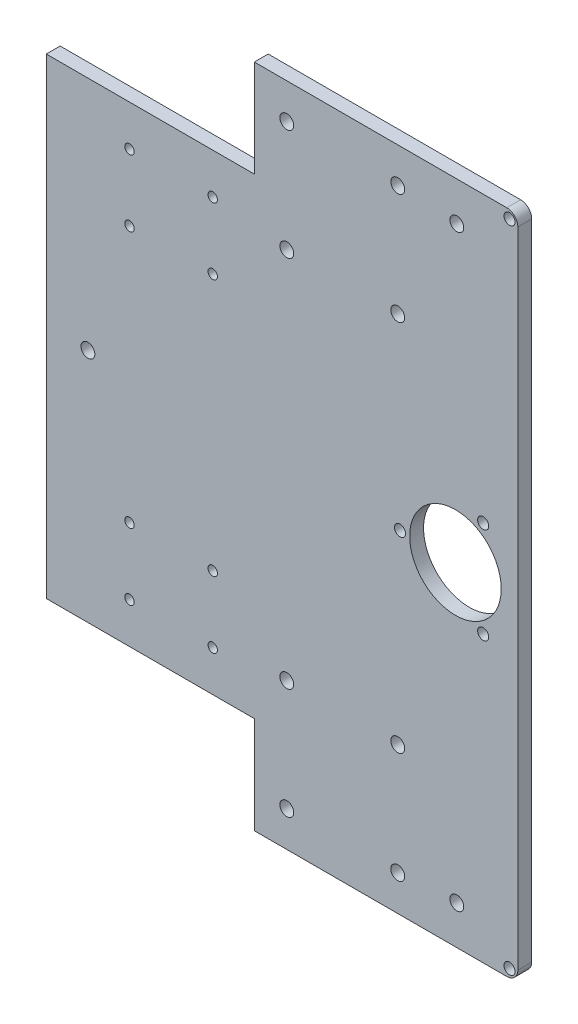
ISO-10303-21;
HEADER;
FILE_DESCRIPTION(('STEP AP214'),'2;1');
FILE_NAME('part.step','',(''),(''),'','','');
FILE_SCHEMA(('AUTOMOTIVE_DESIGN { 1 0 10303 214 1 1 1 1 }'));
ENDSEC;
DATA;
#1=APPLICATION_CONTEXT('core data for automotive mechanical design processes');
#2=APPLICATION_PROTOCOL_DEFINITION('international standard','automotive_design',2000,#1);
#3=PRODUCT_CONTEXT('',#1,'mechanical');
#4=PRODUCT('Part','Part','',(#3));
#5=PRODUCT_RELATED_PRODUCT_CATEGORY('part','',(#4));
#6=PRODUCT_DEFINITION_FORMATION('','',#4);
#7=PRODUCT_DEFINITION_CONTEXT('part definition',#1,'design');
#8=PRODUCT_DEFINITION('design','',#6,#7);
#9=PRODUCT_DEFINITION_SHAPE('','',#8);
#10=(LENGTH_UNIT() NAMED_UNIT(*) SI_UNIT(.MILLI.,.METRE.));
#11=(NAMED_UNIT(*) PLANE_ANGLE_UNIT() SI_UNIT($,.RADIAN.));
#12=(NAMED_UNIT(*) SI_UNIT($,.STERADIAN.) SOLID_ANGLE_UNIT());
#13=UNCERTAINTY_MEASURE_WITH_UNIT(LENGTH_MEASURE(1.E-05),#10,'distance_accuracy_value','');
#14=(GEOMETRIC_REPRESENTATION_CONTEXT(3) GLOBAL_UNCERTAINTY_ASSIGNED_CONTEXT((#13)) GLOBAL_UNIT_ASSIGNED_CONTEXT((#10,
#11,#12)) REPRESENTATION_CONTEXT('',''));
#15=CARTESIAN_POINT('',(0.,0.,0.));
#16=DIRECTION('',(0.,0.,1.));
#17=DIRECTION('',(1.,0.,0.));
#18=AXIS2_PLACEMENT_3D('',#15,#16,#17);
#19=CARTESIAN_POINT('',(85.,120.,5.));
#20=DIRECTION('',(-1.,0.,0.));
#21=DIRECTION('',(0.,0.,1.));
#22=AXIS2_PLACEMENT_3D('',#19,#20,#21);
#23=PLANE('',#22);
#24=DIRECTION('',(0.,1.,0.));
#25=VECTOR('',#24,1.);
#26=CARTESIAN_POINT('',(85.,120.,0.));
#27=LINE('',#26,#25);
#28=CARTESIAN_POINT('',(85.,-116.,0.));
#29=VERTEX_POINT('',#28);
#30=CARTESIAN_POINT('',(85.,116.,0.));
#31=VERTEX_POINT('',#30);
#32=EDGE_CURVE('E119',#29,#31,#27,.T.);
#33=ORIENTED_EDGE('',*,*,#32,.T.);
#34=DIRECTION('',(0.,0.,-1.));
#35=VECTOR('',#34,1.);
#36=CARTESIAN_POINT('',(85.,116.,5.));
#37=LINE('',#36,#35);
#38=CARTESIAN_POINT('',(85.,116.,5.));
#39=VERTEX_POINT('',#38);
#40=EDGE_CURVE('E41',#31,#39,#37,.F.);
#41=ORIENTED_EDGE('',*,*,#40,.T.);
#42=DIRECTION('',(0.,1.,0.));
#43=VECTOR('',#42,1.);
#44=CARTESIAN_POINT('',(85.,120.,5.));
#45=LINE('',#44,#43);
#46=CARTESIAN_POINT('',(85.,-116.,5.));
#47=VERTEX_POINT('',#46);
#48=EDGE_CURVE('E238',#47,#39,#45,.T.);
#49=ORIENTED_EDGE('',*,*,#48,.F.);
#50=DIRECTION('',(0.,0.,-1.));
#51=VECTOR('',#50,1.);
#52=CARTESIAN_POINT('',(85.,-116.,5.));
#53=LINE('',#52,#51);
#54=EDGE_CURVE('E249',#47,#29,#53,.T.);
#55=ORIENTED_EDGE('',*,*,#54,.T.);
#56=EDGE_LOOP('',(#33,#41,#49,#55));
#57=FACE_BOUND('',#56,.T.);
#58=ADVANCED_FACE('F33',(#57),#23,.F.);
#59=CARTESIAN_POINT('',(-85.,120.,5.));
#60=DIRECTION('',(0.,-1.,0.));
#61=DIRECTION('',(0.,0.,-1.));
#62=AXIS2_PLACEMENT_3D('',#59,#60,#61);
#63=PLANE('',#62);
#64=DIRECTION('',(-1.,0.,0.));
#65=VECTOR('',#64,1.);
#66=CARTESIAN_POINT('',(-85.,120.,5.));
#67=LINE('',#66,#65);
#68=CARTESIAN_POINT('',(81.,120.,5.));
#69=VERTEX_POINT('',#68);
#70=CARTESIAN_POINT('',(-10.,120.,5.));
#71=VERTEX_POINT('',#70);
#72=EDGE_CURVE('E240',#69,#71,#67,.T.);
#73=ORIENTED_EDGE('',*,*,#72,.F.);
#74=DIRECTION('',(0.,0.,-1.));
#75=VECTOR('',#74,1.);
#76=CARTESIAN_POINT('',(81.,120.,5.));
#77=LINE('',#76,#75);
#78=CARTESIAN_POINT('',(81.,120.,0.));
#79=VERTEX_POINT('',#78);
#80=EDGE_CURVE('E116',#69,#79,#77,.T.);
#81=ORIENTED_EDGE('',*,*,#80,.T.);
#82=DIRECTION('',(-1.,0.,0.));
#83=VECTOR('',#82,1.);
#84=CARTESIAN_POINT('',(-85.,120.,0.));
#85=LINE('',#84,#83);
#86=CARTESIAN_POINT('',(-10.,120.,0.));
#87=VERTEX_POINT('',#86);
#88=EDGE_CURVE('E110',#79,#87,#85,.T.);
#89=ORIENTED_EDGE('',*,*,#88,.T.);
#90=DIRECTION('',(0.,0.,1.));
#91=VECTOR('',#90,1.);
#92=CARTESIAN_POINT('',(-10.,120.,0.));
#93=LINE('',#92,#91);
#94=EDGE_CURVE('E114',#87,#71,#93,.T.);
#95=ORIENTED_EDGE('',*,*,#94,.T.);
#96=EDGE_LOOP('',(#73,#81,#89,#95));
#97=FACE_BOUND('',#96,.T.);
#98=ADVANCED_FACE('F113',(#97),#63,.F.);
#99=CARTESIAN_POINT('',(-85.,120.,5.));
#100=DIRECTION('',(1.,0.,0.));
#101=DIRECTION('',(0.,1.,0.));
#102=AXIS2_PLACEMENT_3D('',#99,#100,#101);
#103=PLANE('',#102);
#104=DIRECTION('',(0.,-1.,0.));
#105=VECTOR('',#104,1.);
#106=CARTESIAN_POINT('',(-85.,120.,5.));
#107=LINE('',#106,#105);
#108=CARTESIAN_POINT('',(-85.,85.,5.));
#109=VERTEX_POINT('',#108);
#110=CARTESIAN_POINT('',(-85.,-85.,5.));
#111=VERTEX_POINT('',#110);
#112=EDGE_CURVE('E243',#109,#111,#107,.T.);
#113=ORIENTED_EDGE('',*,*,#112,.F.);
#114=DIRECTION('',(0.,0.,1.));
#115=VECTOR('',#114,1.);
#116=CARTESIAN_POINT('',(-85.,85.,0.));
#117=LINE('',#116,#115);
#118=CARTESIAN_POINT('',(-85.,85.,0.));
#119=VERTEX_POINT('',#118);
#120=EDGE_CURVE('E128',#119,#109,#117,.T.);
#121=ORIENTED_EDGE('',*,*,#120,.F.);
#122=DIRECTION('',(0.,-1.,0.));
#123=VECTOR('',#122,1.);
#124=CARTESIAN_POINT('',(-85.,120.,0.));
#125=LINE('',#124,#123);
#126=CARTESIAN_POINT('',(-85.,-85.,0.));
#127=VERTEX_POINT('',#126);
#128=EDGE_CURVE('E118',#119,#127,#125,.T.);
#129=ORIENTED_EDGE('',*,*,#128,.T.);
#130=DIRECTION('',(0.,0.,1.));
#131=VECTOR('',#130,1.);
#132=CARTESIAN_POINT('',(-85.,-85.,0.));
#133=LINE('',#132,#131);
#134=EDGE_CURVE('E163',#127,#111,#133,.T.);
#135=ORIENTED_EDGE('',*,*,#134,.T.);
#136=EDGE_LOOP('',(#113,#121,#129,#135));
#137=FACE_BOUND('',#136,.T.);
#138=ADVANCED_FACE('F288',(#137),#103,.F.);
#139=CARTESIAN_POINT('',(-85.,-120.,5.));
#140=DIRECTION('',(0.,1.,0.));
#141=DIRECTION('',(0.,0.,1.));
#142=AXIS2_PLACEMENT_3D('',#139,#140,#141);
#143=PLANE('',#142);
#144=DIRECTION('',(1.,0.,0.));
#145=VECTOR('',#144,1.);
#146=CARTESIAN_POINT('',(-85.,-120.,0.));
#147=LINE('',#146,#145);
#148=CARTESIAN_POINT('',(-10.,-120.,0.));
#149=VERTEX_POINT('',#148);
#150=CARTESIAN_POINT('',(81.,-120.,0.));
#151=VERTEX_POINT('',#150);
#152=EDGE_CURVE('E241',#149,#151,#147,.T.);
#153=ORIENTED_EDGE('',*,*,#152,.T.);
#154=DIRECTION('',(0.,0.,-1.));
#155=VECTOR('',#154,1.);
#156=CARTESIAN_POINT('',(81.,-120.,5.));
#157=LINE('',#156,#155);
#158=CARTESIAN_POINT('',(81.,-120.,5.));
#159=VERTEX_POINT('',#158);
#160=EDGE_CURVE('E259',#151,#159,#157,.F.);
#161=ORIENTED_EDGE('',*,*,#160,.T.);
#162=DIRECTION('',(1.,0.,0.));
#163=VECTOR('',#162,1.);
#164=CARTESIAN_POINT('',(-85.,-120.,5.));
#165=LINE('',#164,#163);
#166=CARTESIAN_POINT('',(-10.,-120.,5.));
#167=VERTEX_POINT('',#166);
#168=EDGE_CURVE('E246',#167,#159,#165,.T.);
#169=ORIENTED_EDGE('',*,*,#168,.F.);
#170=DIRECTION('',(0.,0.,1.));
#171=VECTOR('',#170,1.);
#172=CARTESIAN_POINT('',(-10.,-120.,0.));
#173=LINE('',#172,#171);
#174=EDGE_CURVE('E143',#149,#167,#173,.T.);
#175=ORIENTED_EDGE('',*,*,#174,.F.);
#176=EDGE_LOOP('',(#153,#161,#169,#175));
#177=FACE_BOUND('',#176,.T.);
#178=ADVANCED_FACE('F278',(#177),#143,.F.);
#179=CARTESIAN_POINT('',(0.,0.,5.));
#180=DIRECTION('',(0.,0.,1.));
#181=DIRECTION('',(1.,0.,0.));
#182=AXIS2_PLACEMENT_3D('',#179,#180,#181);
#183=PLANE('',#182);
#184=CARTESIAN_POINT('',(62.9999999999836,105.99999999999,5.));
#185=DIRECTION('',(0.,0.,-1.));
#186=DIRECTION('',(-1.,0.,0.));
#187=AXIS2_PLACEMENT_3D('',#184,#185,#186);
#188=CIRCLE('',#187,2.49999999998859);
#189=CARTESIAN_POINT('',(60.499999999995,105.99999999999,5.));
#190=VERTEX_POINT('',#189);
#191=EDGE_CURVE('E596',#190,#190,#188,.T.);
#192=ORIENTED_EDGE('',*,*,#191,.T.);
#193=EDGE_LOOP('',(#192));
#194=FACE_BOUND('',#193,.T.);
#195=CARTESIAN_POINT('',(62.9999999999836,-105.99999999999,5.));
#196=DIRECTION('',(0.,0.,-1.));
#197=DIRECTION('',(-1.,0.,0.));
#198=AXIS2_PLACEMENT_3D('',#195,#196,#197);
#199=CIRCLE('',#198,2.5);
#200=CARTESIAN_POINT('',(60.4999999999836,-105.99999999999,5.));
#201=VERTEX_POINT('',#200);
#202=EDGE_CURVE('E600',#201,#201,#199,.T.);
#203=ORIENTED_EDGE('',*,*,#202,.T.);
#204=EDGE_LOOP('',(#203));
#205=FACE_BOUND('',#204,.T.);
#206=CARTESIAN_POINT('',(-69.9999999999836,-3.0158167629857E-12,5.));
#207=DIRECTION('',(0.,0.,-1.));
#208=DIRECTION('',(-1.,0.,0.));
#209=AXIS2_PLACEMENT_3D('',#206,#207,#208);
#210=CIRCLE('',#209,2.50000000000001);
#211=CARTESIAN_POINT('',(-72.4999999999836,-3.0158167629857E-12,5.));
#212=VERTEX_POINT('',#211);
#213=EDGE_CURVE('E610',#212,#212,#210,.T.);
#214=ORIENTED_EDGE('',*,*,#213,.T.);
#215=EDGE_LOOP('',(#214));
#216=FACE_BOUND('',#215,.T.);
#217=CARTESIAN_POINT('',(41.7,-107.25,5.));
#218=DIRECTION('',(0.,0.,1.));
#219=DIRECTION('',(1.,0.,0.));
#220=AXIS2_PLACEMENT_3D('',#217,#218,#219);
#221=CIRCLE('',#220,2.50000000000003);
#222=CARTESIAN_POINT('',(44.2,-107.25,5.));
#223=VERTEX_POINT('',#222);
#224=EDGE_CURVE('E619',#223,#223,#221,.T.);
#225=ORIENTED_EDGE('',*,*,#224,.F.);
#226=EDGE_LOOP('',(#225));
#227=FACE_BOUND('',#226,.T.);
#228=CARTESIAN_POINT('',(1.7,107.25,5.));
#229=DIRECTION('',(0.,0.,1.));
#230=DIRECTION('',(1.,0.,0.));
#231=AXIS2_PLACEMENT_3D('',#228,#229,#230);
#232=CIRCLE('',#231,2.5);
#233=CARTESIAN_POINT('',(4.2,107.25,5.));
#234=VERTEX_POINT('',#233);
#235=EDGE_CURVE('E638',#234,#234,#232,.T.);
#236=ORIENTED_EDGE('',*,*,#235,.F.);
#237=EDGE_LOOP('',(#236));
#238=FACE_BOUND('',#237,.T.);
#239=CARTESIAN_POINT('',(1.7,67.25,5.));
#240=DIRECTION('',(0.,0.,1.));
#241=DIRECTION('',(1.,0.,0.));
#242=AXIS2_PLACEMENT_3D('',#239,#240,#241);
#243=CIRCLE('',#242,2.5);
#244=CARTESIAN_POINT('',(4.2,67.25,5.));
#245=VERTEX_POINT('',#244);
#246=EDGE_CURVE('E637',#245,#245,#243,.T.);
#247=ORIENTED_EDGE('',*,*,#246,.F.);
#248=EDGE_LOOP('',(#247));
#249=FACE_BOUND('',#248,.T.);
#250=CARTESIAN_POINT('',(41.7,67.25,5.));
#251=DIRECTION('',(0.,0.,1.));
#252=DIRECTION('',(1.,0.,0.));
#253=AXIS2_PLACEMENT_3D('',#250,#251,#252);
#254=CIRCLE('',#253,2.5);
#255=CARTESIAN_POINT('',(44.2,67.25,5.));
#256=VERTEX_POINT('',#255);
#257=EDGE_CURVE('E650',#256,#256,#254,.T.);
#258=ORIENTED_EDGE('',*,*,#257,.F.);
#259=EDGE_LOOP('',(#258));
#260=FACE_BOUND('',#259,.T.);
#261=CARTESIAN_POINT('',(1.70000000000001,-107.25,5.));
#262=DIRECTION('',(0.,0.,1.));
#263=DIRECTION('',(1.,0.,0.));
#264=AXIS2_PLACEMENT_3D('',#261,#262,#263);
#265=CIRCLE('',#264,2.50000000000003);
#266=CARTESIAN_POINT('',(4.20000000000004,-107.25,5.));
#267=VERTEX_POINT('',#266);
#268=EDGE_CURVE('E620',#267,#267,#265,.T.);
#269=ORIENTED_EDGE('',*,*,#268,.F.);
#270=EDGE_LOOP('',(#269));
#271=FACE_BOUND('',#270,.T.);
#272=CARTESIAN_POINT('',(1.70000000000001,-67.2499999999999,5.));
#273=DIRECTION('',(0.,0.,1.));
#274=DIRECTION('',(1.,0.,0.));
#275=AXIS2_PLACEMENT_3D('',#272,#273,#274);
#276=CIRCLE('',#275,2.50000000000003);
#277=CARTESIAN_POINT('',(4.20000000000004,-67.2499999999999,5.));
#278=VERTEX_POINT('',#277);
#279=EDGE_CURVE('E626',#278,#278,#276,.T.);
#280=ORIENTED_EDGE('',*,*,#279,.F.);
#281=EDGE_LOOP('',(#280));
#282=FACE_BOUND('',#281,.T.);
#283=CARTESIAN_POINT('',(41.7,-67.2499999999999,5.));
#284=DIRECTION('',(0.,0.,1.));
#285=DIRECTION('',(1.,0.,0.));
#286=AXIS2_PLACEMENT_3D('',#283,#284,#285);
#287=CIRCLE('',#286,2.50000000000003);
#288=CARTESIAN_POINT('',(44.2,-67.2499999999999,5.));
#289=VERTEX_POINT('',#288);
#290=EDGE_CURVE('E602',#289,#289,#287,.T.);
#291=ORIENTED_EDGE('',*,*,#290,.F.);
#292=EDGE_LOOP('',(#291));
#293=FACE_BOUND('',#292,.T.);
#294=CARTESIAN_POINT('',(41.7,107.25,5.));
#295=DIRECTION('',(0.,0.,1.));
#296=DIRECTION('',(1.,0.,0.));
#297=AXIS2_PLACEMENT_3D('',#294,#295,#296);
#298=CIRCLE('',#297,2.5);
#299=CARTESIAN_POINT('',(44.2,107.25,5.));
#300=VERTEX_POINT('',#299);
#301=EDGE_CURVE('E649',#300,#300,#298,.T.);
#302=ORIENTED_EDGE('',*,*,#301,.F.);
#303=EDGE_LOOP('',(#302));
#304=FACE_BOUND('',#303,.T.);
#305=CARTESIAN_POINT('',(82.,117.,5.));
#306=DIRECTION('',(0.,0.,-1.));
#307=DIRECTION('',(1.,0.,0.));
#308=AXIS2_PLACEMENT_3D('',#305,#306,#307);
#309=CIRCLE('',#308,2.);
#310=CARTESIAN_POINT('',(84.,117.,5.));
#311=VERTEX_POINT('',#310);
#312=EDGE_CURVE('E661',#311,#311,#309,.T.);
#313=ORIENTED_EDGE('',*,*,#312,.T.);
#314=EDGE_LOOP('',(#313));
#315=FACE_BOUND('',#314,.T.);
#316=CARTESIAN_POINT('',(82.,-117.,5.));
#317=DIRECTION('',(0.,0.,1.));
#318=DIRECTION('',(1.,0.,0.));
#319=AXIS2_PLACEMENT_3D('',#316,#317,#318);
#320=CIRCLE('',#319,2.);
#321=CARTESIAN_POINT('',(84.,-117.,5.));
#322=VERTEX_POINT('',#321);
#323=EDGE_CURVE('E140',#322,#322,#320,.T.);
#324=ORIENTED_EDGE('',*,*,#323,.F.);
#325=EDGE_LOOP('',(#324));
#326=FACE_BOUND('',#325,.T.);
#327=ORIENTED_EDGE('',*,*,#48,.T.);
#328=CARTESIAN_POINT('',(81.,116.,5.));
#329=DIRECTION('',(0.,0.,1.));
#330=DIRECTION('',(1.,0.,0.));
#331=AXIS2_PLACEMENT_3D('',#328,#329,#330);
#332=CIRCLE('',#331,4.);
#333=EDGE_CURVE('E11',#39,#69,#332,.T.);
#334=ORIENTED_EDGE('',*,*,#333,.T.);
#335=ORIENTED_EDGE('',*,*,#72,.T.);
#336=DIRECTION('',(0.,1.,0.));
#337=VECTOR('',#336,1.);
#338=CARTESIAN_POINT('',(-10.,120.,5.));
#339=LINE('',#338,#337);
#340=CARTESIAN_POINT('',(-10.,85.,5.));
#341=VERTEX_POINT('',#340);
#342=EDGE_CURVE('E127',#341,#71,#339,.T.);
#343=ORIENTED_EDGE('',*,*,#342,.F.);
#344=DIRECTION('',(1.,0.,0.));
#345=VECTOR('',#344,1.);
#346=CARTESIAN_POINT('',(-10.,85.,5.));
#347=LINE('',#346,#345);
#348=EDGE_CURVE('E134',#109,#341,#347,.T.);
#349=ORIENTED_EDGE('',*,*,#348,.F.);
#350=ORIENTED_EDGE('',*,*,#112,.T.);
#351=DIRECTION('',(-1.,0.,0.));
#352=VECTOR('',#351,1.);
#353=CARTESIAN_POINT('',(-10.,-85.,5.));
#354=LINE('',#353,#352);
#355=CARTESIAN_POINT('',(-10.,-85.,5.));
#356=VERTEX_POINT('',#355);
#357=EDGE_CURVE('E153',#356,#111,#354,.T.);
#358=ORIENTED_EDGE('',*,*,#357,.F.);
#359=DIRECTION('',(0.,1.,0.));
#360=VECTOR('',#359,1.);
#361=CARTESIAN_POINT('',(-10.,-120.,5.));
#362=LINE('',#361,#360);
#363=EDGE_CURVE('E157',#167,#356,#362,.T.);
#364=ORIENTED_EDGE('',*,*,#363,.F.);
#365=ORIENTED_EDGE('',*,*,#168,.T.);
#366=CARTESIAN_POINT('',(81.,-116.,5.));
#367=DIRECTION('',(0.,0.,1.));
#368=DIRECTION('',(1.,0.,0.));
#369=AXIS2_PLACEMENT_3D('',#366,#367,#368);
#370=CIRCLE('',#369,4.);
#371=EDGE_CURVE('E261',#159,#47,#370,.T.);
#372=ORIENTED_EDGE('',*,*,#371,.T.);
#373=EDGE_LOOP('',(#327,#334,#335,#343,#349,#350,#358,#364,#365,#372));
#374=FACE_BOUND('',#373,.T.);
#375=CARTESIAN_POINT('',(-54.9999999999958,-70.3125,5.));
#376=DIRECTION('',(0.,0.,1.));
#377=DIRECTION('',(-1.,0.,0.));
#378=AXIS2_PLACEMENT_3D('',#375,#376,#377);
#379=CIRCLE('',#378,1.70000000000013);
#380=CARTESIAN_POINT('',(-56.6999999999959,-70.3125,5.));
#381=VERTEX_POINT('',#380);
#382=EDGE_CURVE('E176',#381,#381,#379,.T.);
#383=ORIENTED_EDGE('',*,*,#382,.F.);
#384=EDGE_LOOP('',(#383));
#385=FACE_BOUND('',#384,.T.);
#386=CARTESIAN_POINT('',(-54.9999999999958,70.3125,5.));
#387=DIRECTION('',(0.,0.,1.));
#388=DIRECTION('',(1.,0.,0.));
#389=AXIS2_PLACEMENT_3D('',#386,#387,#388);
#390=CIRCLE('',#389,1.7000000000001);
#391=CARTESIAN_POINT('',(-53.2999999999957,70.3125,5.));
#392=VERTEX_POINT('',#391);
#393=EDGE_CURVE('E189',#392,#392,#390,.T.);
#394=ORIENTED_EDGE('',*,*,#393,.F.);
#395=EDGE_LOOP('',(#394));
#396=FACE_BOUND('',#395,.T.);
#397=CARTESIAN_POINT('',(-54.9999999999958,46.3125,5.));
#398=DIRECTION('',(0.,0.,1.));
#399=DIRECTION('',(1.,0.,0.));
#400=AXIS2_PLACEMENT_3D('',#397,#398,#399);
#401=CIRCLE('',#400,1.7000000000001);
#402=CARTESIAN_POINT('',(-53.2999999999957,46.3125,5.));
#403=VERTEX_POINT('',#402);
#404=EDGE_CURVE('E188',#403,#403,#401,.T.);
#405=ORIENTED_EDGE('',*,*,#404,.F.);
#406=EDGE_LOOP('',(#405));
#407=FACE_BOUND('',#406,.T.);
#408=CARTESIAN_POINT('',(-24.9999999999958,70.3125,5.));
#409=DIRECTION('',(0.,0.,1.));
#410=DIRECTION('',(1.,0.,0.));
#411=AXIS2_PLACEMENT_3D('',#408,#409,#410);
#412=CIRCLE('',#411,1.70000000000012);
#413=CARTESIAN_POINT('',(-23.2999999999957,70.3125,5.));
#414=VERTEX_POINT('',#413);
#415=EDGE_CURVE('E201',#414,#414,#412,.T.);
#416=ORIENTED_EDGE('',*,*,#415,.F.);
#417=EDGE_LOOP('',(#416));
#418=FACE_BOUND('',#417,.T.);
#419=CARTESIAN_POINT('',(-24.9999999999958,-46.3125,5.));
#420=DIRECTION('',(0.,0.,1.));
#421=DIRECTION('',(-1.,0.,0.));
#422=AXIS2_PLACEMENT_3D('',#419,#420,#421);
#423=CIRCLE('',#422,1.70000000000016);
#424=CARTESIAN_POINT('',(-26.699999999996,-46.3125,5.));
#425=VERTEX_POINT('',#424);
#426=EDGE_CURVE('E147',#425,#425,#423,.T.);
#427=ORIENTED_EDGE('',*,*,#426,.F.);
#428=EDGE_LOOP('',(#427));
#429=FACE_BOUND('',#428,.T.);
#430=CARTESIAN_POINT('',(-54.9999999999958,-46.3125,5.));
#431=DIRECTION('',(0.,0.,1.));
#432=DIRECTION('',(-1.,0.,0.));
#433=AXIS2_PLACEMENT_3D('',#430,#431,#432);
#434=CIRCLE('',#433,1.70000000000013);
#435=CARTESIAN_POINT('',(-56.6999999999959,-46.3125,5.));
#436=VERTEX_POINT('',#435);
#437=EDGE_CURVE('E170',#436,#436,#434,.T.);
#438=ORIENTED_EDGE('',*,*,#437,.F.);
#439=EDGE_LOOP('',(#438));
#440=FACE_BOUND('',#439,.T.);
#441=CARTESIAN_POINT('',(-24.9999999999958,-70.3125,5.));
#442=DIRECTION('',(0.,0.,1.));
#443=DIRECTION('',(-1.,0.,0.));
#444=AXIS2_PLACEMENT_3D('',#441,#442,#443);
#445=CIRCLE('',#444,1.70000000000015);
#446=CARTESIAN_POINT('',(-26.699999999996,-70.3125,5.));
#447=VERTEX_POINT('',#446);
#448=EDGE_CURVE('E177',#447,#447,#445,.T.);
#449=ORIENTED_EDGE('',*,*,#448,.F.);
#450=EDGE_LOOP('',(#449));
#451=FACE_BOUND('',#450,.T.);
#452=CARTESIAN_POINT('',(-24.9999999999958,46.3125,5.));
#453=DIRECTION('',(0.,0.,1.));
#454=DIRECTION('',(1.,0.,0.));
#455=AXIS2_PLACEMENT_3D('',#452,#453,#454);
#456=CIRCLE('',#455,1.70000000000013);
#457=CARTESIAN_POINT('',(-23.2999999999957,46.3125,5.));
#458=VERTEX_POINT('',#457);
#459=EDGE_CURVE('E200',#458,#458,#456,.T.);
#460=ORIENTED_EDGE('',*,*,#459,.F.);
#461=EDGE_LOOP('',(#460));
#462=FACE_BOUND('',#461,.T.);
#463=CARTESIAN_POINT('',(72.5,-17.3205080756889,5.));
#464=DIRECTION('',(0.,0.,1.));
#465=DIRECTION('',(1.,0.,0.));
#466=AXIS2_PLACEMENT_3D('',#463,#464,#465);
#467=CIRCLE('',#466,2.00000000000001);
#468=CARTESIAN_POINT('',(74.5,-17.3205080756889,5.));
#469=VERTEX_POINT('',#468);
#470=EDGE_CURVE('E219',#469,#469,#467,.T.);
#471=ORIENTED_EDGE('',*,*,#470,.F.);
#472=EDGE_LOOP('',(#471));
#473=FACE_BOUND('',#472,.T.);
#474=CARTESIAN_POINT('',(72.5,17.3205080756887,5.));
#475=DIRECTION('',(0.,0.,1.));
#476=DIRECTION('',(1.,0.,0.));
#477=AXIS2_PLACEMENT_3D('',#474,#475,#476);
#478=CIRCLE('',#477,2.);
#479=CARTESIAN_POINT('',(74.5,17.3205080756887,5.));
#480=VERTEX_POINT('',#479);
#481=EDGE_CURVE('E225',#480,#480,#478,.T.);
#482=ORIENTED_EDGE('',*,*,#481,.F.);
#483=EDGE_LOOP('',(#482));
#484=FACE_BOUND('',#483,.T.);
#485=CARTESIAN_POINT('',(42.5,0.,5.));
#486=DIRECTION('',(0.,0.,1.));
#487=DIRECTION('',(1.,0.,0.));
#488=AXIS2_PLACEMENT_3D('',#485,#486,#487);
#489=CIRCLE('',#488,2.);
#490=CARTESIAN_POINT('',(44.5,0.,5.));
#491=VERTEX_POINT('',#490);
#492=EDGE_CURVE('E212',#491,#491,#489,.T.);
#493=ORIENTED_EDGE('',*,*,#492,.F.);
#494=EDGE_LOOP('',(#493));
#495=FACE_BOUND('',#494,.T.);
#496=CARTESIAN_POINT('',(62.5,-1.11022302462516E-13,5.));
#497=DIRECTION('',(0.,0.,1.));
#498=DIRECTION('',(1.,0.,0.));
#499=AXIS2_PLACEMENT_3D('',#496,#497,#498);
#500=CIRCLE('',#499,16.5);
#501=CARTESIAN_POINT('',(79.,-1.11022302462516E-13,5.));
#502=VERTEX_POINT('',#501);
#503=EDGE_CURVE('E218',#502,#502,#500,.T.);
#504=ORIENTED_EDGE('',*,*,#503,.F.);
#505=EDGE_LOOP('',(#504));
#506=FACE_BOUND('',#505,.T.);
#507=ADVANCED_FACE('F266',(#194,#205,#216,#227,#238,#249,#260,#271,#282,#293,#304,#315,#326,
#374,#385,#396,#407,#418,#429,#440,#451,#462,#473,#484,#495,#506),#183,.T.);
#508=CARTESIAN_POINT('',(0.,0.,0.));
#509=DIRECTION('',(0.,0.,1.));
#510=DIRECTION('',(1.,0.,0.));
#511=AXIS2_PLACEMENT_3D('',#508,#509,#510);
#512=PLANE('',#511);
#513=CARTESIAN_POINT('',(62.9999999999836,105.99999999999,0.));
#514=DIRECTION('',(0.,0.,-1.));
#515=DIRECTION('',(-1.,0.,0.));
#516=AXIS2_PLACEMENT_3D('',#513,#514,#515);
#517=CIRCLE('',#516,2.49999999998859);
#518=CARTESIAN_POINT('',(60.499999999995,105.99999999999,0.));
#519=VERTEX_POINT('',#518);
#520=EDGE_CURVE('E599',#519,#519,#517,.T.);
#521=ORIENTED_EDGE('',*,*,#520,.F.);
#522=EDGE_LOOP('',(#521));
#523=FACE_BOUND('',#522,.T.);
#524=CARTESIAN_POINT('',(62.9999999999836,-105.99999999999,0.));
#525=DIRECTION('',(0.,0.,-1.));
#526=DIRECTION('',(-1.,0.,0.));
#527=AXIS2_PLACEMENT_3D('',#524,#525,#526);
#528=CIRCLE('',#527,2.5);
#529=CARTESIAN_POINT('',(60.4999999999836,-105.99999999999,0.));
#530=VERTEX_POINT('',#529);
#531=EDGE_CURVE('E605',#530,#530,#528,.T.);
#532=ORIENTED_EDGE('',*,*,#531,.F.);
#533=EDGE_LOOP('',(#532));
#534=FACE_BOUND('',#533,.T.);
#535=CARTESIAN_POINT('',(-69.9999999999836,-3.0158167629857E-12,0.));
#536=DIRECTION('',(0.,0.,-1.));
#537=DIRECTION('',(-1.,0.,0.));
#538=AXIS2_PLACEMENT_3D('',#535,#536,#537);
#539=CIRCLE('',#538,2.50000000000001);
#540=CARTESIAN_POINT('',(-72.4999999999836,-3.0158167629857E-12,0.));
#541=VERTEX_POINT('',#540);
#542=EDGE_CURVE('E613',#541,#541,#539,.T.);
#543=ORIENTED_EDGE('',*,*,#542,.F.);
#544=EDGE_LOOP('',(#543));
#545=FACE_BOUND('',#544,.T.);
#546=CARTESIAN_POINT('',(41.7,-107.25,0.));
#547=DIRECTION('',(0.,0.,1.));
#548=DIRECTION('',(1.,0.,0.));
#549=AXIS2_PLACEMENT_3D('',#546,#547,#548);
#550=CIRCLE('',#549,2.50000000000003);
#551=CARTESIAN_POINT('',(44.2,-107.25,0.));
#552=VERTEX_POINT('',#551);
#553=EDGE_CURVE('E641',#552,#552,#550,.T.);
#554=ORIENTED_EDGE('',*,*,#553,.T.);
#555=EDGE_LOOP('',(#554));
#556=FACE_BOUND('',#555,.T.);
#557=CARTESIAN_POINT('',(1.7,107.25,0.));
#558=DIRECTION('',(0.,0.,1.));
#559=DIRECTION('',(1.,0.,0.));
#560=AXIS2_PLACEMENT_3D('',#557,#558,#559);
#561=CIRCLE('',#560,2.5);
#562=CARTESIAN_POINT('',(4.2,107.25,0.));
#563=VERTEX_POINT('',#562);
#564=EDGE_CURVE('E634',#563,#563,#561,.T.);
#565=ORIENTED_EDGE('',*,*,#564,.T.);
#566=EDGE_LOOP('',(#565));
#567=FACE_BOUND('',#566,.T.);
#568=CARTESIAN_POINT('',(1.7,67.25,0.));
#569=DIRECTION('',(0.,0.,1.));
#570=DIRECTION('',(1.,0.,0.));
#571=AXIS2_PLACEMENT_3D('',#568,#569,#570);
#572=CIRCLE('',#571,2.5);
#573=CARTESIAN_POINT('',(4.2,67.25,0.));
#574=VERTEX_POINT('',#573);
#575=EDGE_CURVE('E653',#574,#574,#572,.T.);
#576=ORIENTED_EDGE('',*,*,#575,.T.);
#577=EDGE_LOOP('',(#576));
#578=FACE_BOUND('',#577,.T.);
#579=CARTESIAN_POINT('',(41.7,67.25,0.));
#580=DIRECTION('',(0.,0.,1.));
#581=DIRECTION('',(1.,0.,0.));
#582=AXIS2_PLACEMENT_3D('',#579,#580,#581);
#583=CIRCLE('',#582,2.5);
#584=CARTESIAN_POINT('',(44.2,67.25,0.));
#585=VERTEX_POINT('',#584);
#586=EDGE_CURVE('E646',#585,#585,#583,.T.);
#587=ORIENTED_EDGE('',*,*,#586,.T.);
#588=EDGE_LOOP('',(#587));
#589=FACE_BOUND('',#588,.T.);
#590=CARTESIAN_POINT('',(1.70000000000001,-107.25,0.));
#591=DIRECTION('',(0.,0.,1.));
#592=DIRECTION('',(1.,0.,0.));
#593=AXIS2_PLACEMENT_3D('',#590,#591,#592);
#594=CIRCLE('',#593,2.50000000000003);
#595=CARTESIAN_POINT('',(4.20000000000004,-107.25,0.));
#596=VERTEX_POINT('',#595);
#597=EDGE_CURVE('E616',#596,#596,#594,.T.);
#598=ORIENTED_EDGE('',*,*,#597,.T.);
#599=EDGE_LOOP('',(#598));
#600=FACE_BOUND('',#599,.T.);
#601=CARTESIAN_POINT('',(1.70000000000001,-67.2499999999999,0.));
#602=DIRECTION('',(0.,0.,1.));
#603=DIRECTION('',(1.,0.,0.));
#604=AXIS2_PLACEMENT_3D('',#601,#602,#603);
#605=CIRCLE('',#604,2.50000000000003);
#606=CARTESIAN_POINT('',(4.20000000000004,-67.2499999999999,0.));
#607=VERTEX_POINT('',#606);
#608=EDGE_CURVE('E623',#607,#607,#605,.T.);
#609=ORIENTED_EDGE('',*,*,#608,.T.);
#610=EDGE_LOOP('',(#609));
#611=FACE_BOUND('',#610,.T.);
#612=CARTESIAN_POINT('',(41.7,-67.2499999999999,0.));
#613=DIRECTION('',(0.,0.,1.));
#614=DIRECTION('',(1.,0.,0.));
#615=AXIS2_PLACEMENT_3D('',#612,#613,#614);
#616=CIRCLE('',#615,2.50000000000003);
#617=CARTESIAN_POINT('',(44.2,-67.2499999999999,0.));
#618=VERTEX_POINT('',#617);
#619=EDGE_CURVE('E629',#618,#618,#616,.T.);
#620=ORIENTED_EDGE('',*,*,#619,.T.);
#621=EDGE_LOOP('',(#620));
#622=FACE_BOUND('',#621,.T.);
#623=CARTESIAN_POINT('',(41.7,107.25,0.));
#624=DIRECTION('',(0.,0.,1.));
#625=DIRECTION('',(1.,0.,0.));
#626=AXIS2_PLACEMENT_3D('',#623,#624,#625);
#627=CIRCLE('',#626,2.5);
#628=CARTESIAN_POINT('',(44.2,107.25,0.));
#629=VERTEX_POINT('',#628);
#630=EDGE_CURVE('E658',#629,#629,#627,.T.);
#631=ORIENTED_EDGE('',*,*,#630,.T.);
#632=EDGE_LOOP('',(#631));
#633=FACE_BOUND('',#632,.T.);
#634=CARTESIAN_POINT('',(82.,117.,0.));
#635=DIRECTION('',(0.,0.,-1.));
#636=DIRECTION('',(1.,0.,0.));
#637=AXIS2_PLACEMENT_3D('',#634,#635,#636);
#638=CIRCLE('',#637,2.);
#639=CARTESIAN_POINT('',(84.,117.,0.));
#640=VERTEX_POINT('',#639);
#641=EDGE_CURVE('E664',#640,#640,#638,.T.);
#642=ORIENTED_EDGE('',*,*,#641,.F.);
#643=EDGE_LOOP('',(#642));
#644=FACE_BOUND('',#643,.T.);
#645=CARTESIAN_POINT('',(82.,-117.,0.));
#646=DIRECTION('',(0.,0.,1.));
#647=DIRECTION('',(1.,0.,0.));
#648=AXIS2_PLACEMENT_3D('',#645,#646,#647);
#649=CIRCLE('',#648,2.);
#650=CARTESIAN_POINT('',(84.,-117.,0.));
#651=VERTEX_POINT('',#650);
#652=EDGE_CURVE('E160',#651,#651,#649,.T.);
#653=ORIENTED_EDGE('',*,*,#652,.T.);
#654=EDGE_LOOP('',(#653));
#655=FACE_BOUND('',#654,.T.);
#656=CARTESIAN_POINT('',(-54.9999999999958,-70.3125,0.));
#657=DIRECTION('',(0.,0.,1.));
#658=DIRECTION('',(-1.,0.,0.));
#659=AXIS2_PLACEMENT_3D('',#656,#657,#658);
#660=CIRCLE('',#659,1.70000000000013);
#661=CARTESIAN_POINT('',(-56.6999999999959,-70.3125,0.));
#662=VERTEX_POINT('',#661);
#663=EDGE_CURVE('E192',#662,#662,#660,.T.);
#664=ORIENTED_EDGE('',*,*,#663,.T.);
#665=EDGE_LOOP('',(#664));
#666=FACE_BOUND('',#665,.T.);
#667=CARTESIAN_POINT('',(-54.9999999999958,70.3125,0.));
#668=DIRECTION('',(0.,0.,1.));
#669=DIRECTION('',(1.,0.,0.));
#670=AXIS2_PLACEMENT_3D('',#667,#668,#669);
#671=CIRCLE('',#670,1.7000000000001);
#672=CARTESIAN_POINT('',(-53.2999999999957,70.3125,0.));
#673=VERTEX_POINT('',#672);
#674=EDGE_CURVE('E185',#673,#673,#671,.T.);
#675=ORIENTED_EDGE('',*,*,#674,.T.);
#676=EDGE_LOOP('',(#675));
#677=FACE_BOUND('',#676,.T.);
#678=CARTESIAN_POINT('',(-54.9999999999958,46.3125,0.));
#679=DIRECTION('',(0.,0.,1.));
#680=DIRECTION('',(1.,0.,0.));
#681=AXIS2_PLACEMENT_3D('',#678,#679,#680);
#682=CIRCLE('',#681,1.7000000000001);
#683=CARTESIAN_POINT('',(-53.2999999999957,46.3125,0.));
#684=VERTEX_POINT('',#683);
#685=EDGE_CURVE('E204',#684,#684,#682,.T.);
#686=ORIENTED_EDGE('',*,*,#685,.T.);
#687=EDGE_LOOP('',(#686));
#688=FACE_BOUND('',#687,.T.);
#689=CARTESIAN_POINT('',(-24.9999999999958,70.3125,0.));
#690=DIRECTION('',(0.,0.,1.));
#691=DIRECTION('',(1.,0.,0.));
#692=AXIS2_PLACEMENT_3D('',#689,#690,#691);
#693=CIRCLE('',#692,1.70000000000012);
#694=CARTESIAN_POINT('',(-23.2999999999957,70.3125,0.));
#695=VERTEX_POINT('',#694);
#696=EDGE_CURVE('E197',#695,#695,#693,.T.);
#697=ORIENTED_EDGE('',*,*,#696,.T.);
#698=EDGE_LOOP('',(#697));
#699=FACE_BOUND('',#698,.T.);
#700=CARTESIAN_POINT('',(-24.9999999999958,-46.3125,0.));
#701=DIRECTION('',(0.,0.,1.));
#702=DIRECTION('',(-1.,0.,0.));
#703=AXIS2_PLACEMENT_3D('',#700,#701,#702);
#704=CIRCLE('',#703,1.70000000000016);
#705=CARTESIAN_POINT('',(-26.699999999996,-46.3125,0.));
#706=VERTEX_POINT('',#705);
#707=EDGE_CURVE('E167',#706,#706,#704,.T.);
#708=ORIENTED_EDGE('',*,*,#707,.T.);
#709=EDGE_LOOP('',(#708));
#710=FACE_BOUND('',#709,.T.);
#711=CARTESIAN_POINT('',(-54.9999999999958,-46.3125,0.));
#712=DIRECTION('',(0.,0.,1.));
#713=DIRECTION('',(-1.,0.,0.));
#714=AXIS2_PLACEMENT_3D('',#711,#712,#713);
#715=CIRCLE('',#714,1.70000000000013);
#716=CARTESIAN_POINT('',(-56.6999999999959,-46.3125,0.));
#717=VERTEX_POINT('',#716);
#718=EDGE_CURVE('E180',#717,#717,#715,.T.);
#719=ORIENTED_EDGE('',*,*,#718,.T.);
#720=EDGE_LOOP('',(#719));
#721=FACE_BOUND('',#720,.T.);
#722=CARTESIAN_POINT('',(-24.9999999999958,-70.3125,0.));
#723=DIRECTION('',(0.,0.,1.));
#724=DIRECTION('',(-1.,0.,0.));
#725=AXIS2_PLACEMENT_3D('',#722,#723,#724);
#726=CIRCLE('',#725,1.70000000000015);
#727=CARTESIAN_POINT('',(-26.699999999996,-70.3125,0.));
#728=VERTEX_POINT('',#727);
#729=EDGE_CURVE('E173',#728,#728,#726,.T.);
#730=ORIENTED_EDGE('',*,*,#729,.T.);
#731=EDGE_LOOP('',(#730));
#732=FACE_BOUND('',#731,.T.);
#733=CARTESIAN_POINT('',(-24.9999999999958,46.3125,0.));
#734=DIRECTION('',(0.,0.,1.));
#735=DIRECTION('',(1.,0.,0.));
#736=AXIS2_PLACEMENT_3D('',#733,#734,#735);
#737=CIRCLE('',#736,1.70000000000013);
#738=CARTESIAN_POINT('',(-23.2999999999957,46.3125,0.));
#739=VERTEX_POINT('',#738);
#740=EDGE_CURVE('E209',#739,#739,#737,.T.);
#741=ORIENTED_EDGE('',*,*,#740,.T.);
#742=EDGE_LOOP('',(#741));
#743=FACE_BOUND('',#742,.T.);
#744=CARTESIAN_POINT('',(72.5,-17.3205080756889,0.));
#745=DIRECTION('',(0.,0.,1.));
#746=DIRECTION('',(1.,0.,0.));
#747=AXIS2_PLACEMENT_3D('',#744,#745,#746);
#748=CIRCLE('',#747,2.00000000000001);
#749=CARTESIAN_POINT('',(74.5,-17.3205080756889,0.));
#750=VERTEX_POINT('',#749);
#751=EDGE_CURVE('E215',#750,#750,#748,.T.);
#752=ORIENTED_EDGE('',*,*,#751,.T.);
#753=EDGE_LOOP('',(#752));
#754=FACE_BOUND('',#753,.T.);
#755=CARTESIAN_POINT('',(72.5,17.3205080756887,0.));
#756=DIRECTION('',(0.,0.,1.));
#757=DIRECTION('',(1.,0.,0.));
#758=AXIS2_PLACEMENT_3D('',#755,#756,#757);
#759=CIRCLE('',#758,2.);
#760=CARTESIAN_POINT('',(74.5,17.3205080756887,0.));
#761=VERTEX_POINT('',#760);
#762=EDGE_CURVE('E222',#761,#761,#759,.T.);
#763=ORIENTED_EDGE('',*,*,#762,.T.);
#764=EDGE_LOOP('',(#763));
#765=FACE_BOUND('',#764,.T.);
#766=CARTESIAN_POINT('',(42.5,0.,0.));
#767=DIRECTION('',(0.,0.,1.));
#768=DIRECTION('',(1.,0.,0.));
#769=AXIS2_PLACEMENT_3D('',#766,#767,#768);
#770=CIRCLE('',#769,2.);
#771=CARTESIAN_POINT('',(44.5,0.,0.));
#772=VERTEX_POINT('',#771);
#773=EDGE_CURVE('E228',#772,#772,#770,.T.);
#774=ORIENTED_EDGE('',*,*,#773,.T.);
#775=EDGE_LOOP('',(#774));
#776=FACE_BOUND('',#775,.T.);
#777=CARTESIAN_POINT('',(62.5,-1.11022302462516E-13,0.));
#778=DIRECTION('',(0.,0.,1.));
#779=DIRECTION('',(1.,0.,0.));
#780=AXIS2_PLACEMENT_3D('',#777,#778,#779);
#781=CIRCLE('',#780,16.5);
#782=CARTESIAN_POINT('',(79.,-1.11022302462516E-13,0.));
#783=VERTEX_POINT('',#782);
#784=EDGE_CURVE('E233',#783,#783,#781,.T.);
#785=ORIENTED_EDGE('',*,*,#784,.T.);
#786=EDGE_LOOP('',(#785));
#787=FACE_BOUND('',#786,.T.);
#788=ORIENTED_EDGE('',*,*,#88,.F.);
#789=CARTESIAN_POINT('',(81.,116.,0.));
#790=DIRECTION('',(0.,0.,1.));
#791=DIRECTION('',(1.,0.,0.));
#792=AXIS2_PLACEMENT_3D('',#789,#790,#791);
#793=CIRCLE('',#792,4.);
#794=EDGE_CURVE('E55',#79,#31,#793,.F.);
#795=ORIENTED_EDGE('',*,*,#794,.T.);
#796=ORIENTED_EDGE('',*,*,#32,.F.);
#797=CARTESIAN_POINT('',(81.,-116.,0.));
#798=DIRECTION('',(0.,0.,1.));
#799=DIRECTION('',(1.,0.,0.));
#800=AXIS2_PLACEMENT_3D('',#797,#798,#799);
#801=CIRCLE('',#800,4.);
#802=EDGE_CURVE('E257',#29,#151,#801,.F.);
#803=ORIENTED_EDGE('',*,*,#802,.T.);
#804=ORIENTED_EDGE('',*,*,#152,.F.);
#805=DIRECTION('',(0.,1.,0.));
#806=VECTOR('',#805,1.);
#807=CARTESIAN_POINT('',(-10.,-120.,0.));
#808=LINE('',#807,#806);
#809=CARTESIAN_POINT('',(-10.,-85.,0.));
#810=VERTEX_POINT('',#809);
#811=EDGE_CURVE('E149',#149,#810,#808,.T.);
#812=ORIENTED_EDGE('',*,*,#811,.T.);
#813=DIRECTION('',(-1.,0.,0.));
#814=VECTOR('',#813,1.);
#815=CARTESIAN_POINT('',(-10.,-85.,0.));
#816=LINE('',#815,#814);
#817=EDGE_CURVE('E152',#810,#127,#816,.T.);
#818=ORIENTED_EDGE('',*,*,#817,.T.);
#819=ORIENTED_EDGE('',*,*,#128,.F.);
#820=DIRECTION('',(1.,0.,0.));
#821=VECTOR('',#820,1.);
#822=CARTESIAN_POINT('',(-10.,85.,0.));
#823=LINE('',#822,#821);
#824=CARTESIAN_POINT('',(-10.,85.,0.));
#825=VERTEX_POINT('',#824);
#826=EDGE_CURVE('E129',#119,#825,#823,.T.);
#827=ORIENTED_EDGE('',*,*,#826,.T.);
#828=DIRECTION('',(0.,1.,0.));
#829=VECTOR('',#828,1.);
#830=CARTESIAN_POINT('',(-10.,120.,0.));
#831=LINE('',#830,#829);
#832=EDGE_CURVE('E124',#825,#87,#831,.T.);
#833=ORIENTED_EDGE('',*,*,#832,.T.);
#834=EDGE_LOOP('',(#788,#795,#796,#803,#804,#812,#818,#819,#827,#833));
#835=FACE_BOUND('',#834,.T.);
#836=ADVANCED_FACE('F132',(#523,#534,#545,#556,#567,#578,#589,#600,#611,#622,#633,#644,#655,
#666,#677,#688,#699,#710,#721,#732,#743,#754,#765,#776,#787,#835),#512,.F.);
#837=CARTESIAN_POINT('',(62.5,-1.11022302462516E-13,0.));
#838=DIRECTION('',(0.,0.,1.));
#839=DIRECTION('',(1.,0.,0.));
#840=AXIS2_PLACEMENT_3D('',#837,#838,#839);
#841=CYLINDRICAL_SURFACE('',#840,16.5);
#842=ORIENTED_EDGE('',*,*,#784,.F.);
#843=EDGE_LOOP('',(#842));
#844=FACE_BOUND('',#843,.T.);
#845=ORIENTED_EDGE('',*,*,#503,.T.);
#846=EDGE_LOOP('',(#845));
#847=FACE_BOUND('',#846,.T.);
#848=ADVANCED_FACE('F373',(#844,#847),#841,.F.);
#849=CARTESIAN_POINT('',(42.5,0.,0.));
#850=DIRECTION('',(0.,0.,1.));
#851=DIRECTION('',(1.,0.,0.));
#852=AXIS2_PLACEMENT_3D('',#849,#850,#851);
#853=CYLINDRICAL_SURFACE('',#852,2.);
#854=ORIENTED_EDGE('',*,*,#773,.F.);
#855=EDGE_LOOP('',(#854));
#856=FACE_BOUND('',#855,.T.);
#857=ORIENTED_EDGE('',*,*,#492,.T.);
#858=EDGE_LOOP('',(#857));
#859=FACE_BOUND('',#858,.T.);
#860=ADVANCED_FACE('F369',(#856,#859),#853,.F.);
#861=CARTESIAN_POINT('',(72.5,17.3205080756887,0.));
#862=DIRECTION('',(0.,0.,1.));
#863=DIRECTION('',(1.,0.,0.));
#864=AXIS2_PLACEMENT_3D('',#861,#862,#863);
#865=CYLINDRICAL_SURFACE('',#864,2.);
#866=ORIENTED_EDGE('',*,*,#762,.F.);
#867=EDGE_LOOP('',(#866));
#868=FACE_BOUND('',#867,.T.);
#869=ORIENTED_EDGE('',*,*,#481,.T.);
#870=EDGE_LOOP('',(#869));
#871=FACE_BOUND('',#870,.T.);
#872=ADVANCED_FACE('F365',(#868,#871),#865,.F.);
#873=CARTESIAN_POINT('',(72.5,-17.3205080756889,0.));
#874=DIRECTION('',(0.,0.,1.));
#875=DIRECTION('',(1.,0.,0.));
#876=AXIS2_PLACEMENT_3D('',#873,#874,#875);
#877=CYLINDRICAL_SURFACE('',#876,2.00000000000001);
#878=ORIENTED_EDGE('',*,*,#751,.F.);
#879=EDGE_LOOP('',(#878));
#880=FACE_BOUND('',#879,.T.);
#881=ORIENTED_EDGE('',*,*,#470,.T.);
#882=EDGE_LOOP('',(#881));
#883=FACE_BOUND('',#882,.T.);
#884=ADVANCED_FACE('F361',(#880,#883),#877,.F.);
#885=CARTESIAN_POINT('',(-24.9999999999958,46.3125,0.));
#886=DIRECTION('',(0.,0.,1.));
#887=DIRECTION('',(1.,0.,0.));
#888=AXIS2_PLACEMENT_3D('',#885,#886,#887);
#889=CYLINDRICAL_SURFACE('',#888,1.70000000000013);
#890=ORIENTED_EDGE('',*,*,#740,.F.);
#891=EDGE_LOOP('',(#890));
#892=FACE_BOUND('',#891,.T.);
#893=ORIENTED_EDGE('',*,*,#459,.T.);
#894=EDGE_LOOP('',(#893));
#895=FACE_BOUND('',#894,.T.);
#896=ADVANCED_FACE('F340',(#892,#895),#889,.F.);
#897=CARTESIAN_POINT('',(-24.9999999999958,-70.3125,0.));
#898=DIRECTION('',(0.,0.,1.));
#899=DIRECTION('',(1.,0.,0.));
#900=AXIS2_PLACEMENT_3D('',#897,#898,#899);
#901=CYLINDRICAL_SURFACE('',#900,1.70000000000015);
#902=ORIENTED_EDGE('',*,*,#729,.F.);
#903=EDGE_LOOP('',(#902));
#904=FACE_BOUND('',#903,.T.);
#905=ORIENTED_EDGE('',*,*,#448,.T.);
#906=EDGE_LOOP('',(#905));
#907=FACE_BOUND('',#906,.T.);
#908=ADVANCED_FACE('F337',(#904,#907),#901,.F.);
#909=CARTESIAN_POINT('',(-54.9999999999958,-46.3125,0.));
#910=DIRECTION('',(0.,0.,1.));
#911=DIRECTION('',(1.,0.,0.));
#912=AXIS2_PLACEMENT_3D('',#909,#910,#911);
#913=CYLINDRICAL_SURFACE('',#912,1.70000000000013);
#914=ORIENTED_EDGE('',*,*,#718,.F.);
#915=EDGE_LOOP('',(#914));
#916=FACE_BOUND('',#915,.T.);
#917=ORIENTED_EDGE('',*,*,#437,.T.);
#918=EDGE_LOOP('',(#917));
#919=FACE_BOUND('',#918,.T.);
#920=ADVANCED_FACE('F335',(#916,#919),#913,.F.);
#921=CARTESIAN_POINT('',(-24.9999999999958,-46.3125,0.));
#922=DIRECTION('',(0.,0.,1.));
#923=DIRECTION('',(1.,0.,0.));
#924=AXIS2_PLACEMENT_3D('',#921,#922,#923);
#925=CYLINDRICAL_SURFACE('',#924,1.70000000000016);
#926=ORIENTED_EDGE('',*,*,#707,.F.);
#927=EDGE_LOOP('',(#926));
#928=FACE_BOUND('',#927,.T.);
#929=ORIENTED_EDGE('',*,*,#426,.T.);
#930=EDGE_LOOP('',(#929));
#931=FACE_BOUND('',#930,.T.);
#932=ADVANCED_FACE('F331',(#928,#931),#925,.F.);
#933=CARTESIAN_POINT('',(-24.9999999999958,70.3125,0.));
#934=DIRECTION('',(0.,0.,1.));
#935=DIRECTION('',(1.,0.,0.));
#936=AXIS2_PLACEMENT_3D('',#933,#934,#935);
#937=CYLINDRICAL_SURFACE('',#936,1.70000000000012);
#938=ORIENTED_EDGE('',*,*,#696,.F.);
#939=EDGE_LOOP('',(#938));
#940=FACE_BOUND('',#939,.T.);
#941=ORIENTED_EDGE('',*,*,#415,.T.);
#942=EDGE_LOOP('',(#941));
#943=FACE_BOUND('',#942,.T.);
#944=ADVANCED_FACE('F334',(#940,#943),#937,.F.);
#945=CARTESIAN_POINT('',(-54.9999999999958,46.3125,0.));
#946=DIRECTION('',(0.,0.,1.));
#947=DIRECTION('',(1.,0.,0.));
#948=AXIS2_PLACEMENT_3D('',#945,#946,#947);
#949=CYLINDRICAL_SURFACE('',#948,1.7000000000001);
#950=ORIENTED_EDGE('',*,*,#685,.F.);
#951=EDGE_LOOP('',(#950));
#952=FACE_BOUND('',#951,.T.);
#953=ORIENTED_EDGE('',*,*,#404,.T.);
#954=EDGE_LOOP('',(#953));
#955=FACE_BOUND('',#954,.T.);
#956=ADVANCED_FACE('F348',(#952,#955),#949,.F.);
#957=CARTESIAN_POINT('',(-54.9999999999958,70.3125,0.));
#958=DIRECTION('',(0.,0.,1.));
#959=DIRECTION('',(1.,0.,0.));
#960=AXIS2_PLACEMENT_3D('',#957,#958,#959);
#961=CYLINDRICAL_SURFACE('',#960,1.7000000000001);
#962=ORIENTED_EDGE('',*,*,#674,.F.);
#963=EDGE_LOOP('',(#962));
#964=FACE_BOUND('',#963,.T.);
#965=ORIENTED_EDGE('',*,*,#393,.T.);
#966=EDGE_LOOP('',(#965));
#967=FACE_BOUND('',#966,.T.);
#968=ADVANCED_FACE('F345',(#964,#967),#961,.F.);
#969=CARTESIAN_POINT('',(-54.9999999999958,-70.3125,0.));
#970=DIRECTION('',(0.,0.,1.));
#971=DIRECTION('',(1.,0.,0.));
#972=AXIS2_PLACEMENT_3D('',#969,#970,#971);
#973=CYLINDRICAL_SURFACE('',#972,1.70000000000013);
#974=ORIENTED_EDGE('',*,*,#663,.F.);
#975=EDGE_LOOP('',(#974));
#976=FACE_BOUND('',#975,.T.);
#977=ORIENTED_EDGE('',*,*,#382,.T.);
#978=EDGE_LOOP('',(#977));
#979=FACE_BOUND('',#978,.T.);
#980=ADVANCED_FACE('F330',(#976,#979),#973,.F.);
#981=CARTESIAN_POINT('',(-10.,-120.,0.));
#982=DIRECTION('',(1.,0.,0.));
#983=DIRECTION('',(0.,1.,0.));
#984=AXIS2_PLACEMENT_3D('',#981,#982,#983);
#985=PLANE('',#984);
#986=ORIENTED_EDGE('',*,*,#363,.T.);
#987=DIRECTION('',(0.,0.,1.));
#988=VECTOR('',#987,1.);
#989=CARTESIAN_POINT('',(-10.,-85.,0.));
#990=LINE('',#989,#988);
#991=EDGE_CURVE('E156',#810,#356,#990,.T.);
#992=ORIENTED_EDGE('',*,*,#991,.F.);
#993=ORIENTED_EDGE('',*,*,#811,.F.);
#994=ORIENTED_EDGE('',*,*,#174,.T.);
#995=EDGE_LOOP('',(#986,#992,#993,#994));
#996=FACE_BOUND('',#995,.T.);
#997=ADVANCED_FACE('F280',(#996),#985,.F.);
#998=CARTESIAN_POINT('',(-10.,-85.,0.));
#999=DIRECTION('',(0.,1.,0.));
#1000=DIRECTION('',(-1.,0.,0.));
#1001=AXIS2_PLACEMENT_3D('',#998,#999,#1000);
#1002=PLANE('',#1001);
#1003=ORIENTED_EDGE('',*,*,#357,.T.);
#1004=ORIENTED_EDGE('',*,*,#134,.F.);
#1005=ORIENTED_EDGE('',*,*,#817,.F.);
#1006=ORIENTED_EDGE('',*,*,#991,.T.);
#1007=EDGE_LOOP('',(#1003,#1004,#1005,#1006));
#1008=FACE_BOUND('',#1007,.T.);
#1009=ADVANCED_FACE('F285',(#1008),#1002,.F.);
#1010=CARTESIAN_POINT('',(-10.,120.,0.));
#1011=DIRECTION('',(1.,0.,0.));
#1012=DIRECTION('',(0.,1.,0.));
#1013=AXIS2_PLACEMENT_3D('',#1010,#1011,#1012);
#1014=PLANE('',#1013);
#1015=ORIENTED_EDGE('',*,*,#342,.T.);
#1016=ORIENTED_EDGE('',*,*,#94,.F.);
#1017=ORIENTED_EDGE('',*,*,#832,.F.);
#1018=DIRECTION('',(0.,0.,1.));
#1019=VECTOR('',#1018,1.);
#1020=CARTESIAN_POINT('',(-10.,85.,0.));
#1021=LINE('',#1020,#1019);
#1022=EDGE_CURVE('E145',#825,#341,#1021,.T.);
#1023=ORIENTED_EDGE('',*,*,#1022,.T.);
#1024=EDGE_LOOP('',(#1015,#1016,#1017,#1023));
#1025=FACE_BOUND('',#1024,.T.);
#1026=ADVANCED_FACE('F123',(#1025),#1014,.F.);
#1027=CARTESIAN_POINT('',(-10.,85.,0.));
#1028=DIRECTION('',(0.,-1.,0.));
#1029=DIRECTION('',(1.,0.,0.));
#1030=AXIS2_PLACEMENT_3D('',#1027,#1028,#1029);
#1031=PLANE('',#1030);
#1032=ORIENTED_EDGE('',*,*,#348,.T.);
#1033=ORIENTED_EDGE('',*,*,#1022,.F.);
#1034=ORIENTED_EDGE('',*,*,#826,.F.);
#1035=ORIENTED_EDGE('',*,*,#120,.T.);
#1036=EDGE_LOOP('',(#1032,#1033,#1034,#1035));
#1037=FACE_BOUND('',#1036,.T.);
#1038=ADVANCED_FACE('F291',(#1037),#1031,.F.);
#1039=CARTESIAN_POINT('',(81.,-116.,5.));
#1040=DIRECTION('',(0.,0.,-1.));
#1041=DIRECTION('',(-1.,0.,0.));
#1042=AXIS2_PLACEMENT_3D('',#1039,#1040,#1041);
#1043=CYLINDRICAL_SURFACE('',#1042,4.);
#1044=ORIENTED_EDGE('',*,*,#371,.F.);
#1045=ORIENTED_EDGE('',*,*,#160,.F.);
#1046=ORIENTED_EDGE('',*,*,#802,.F.);
#1047=ORIENTED_EDGE('',*,*,#54,.F.);
#1048=EDGE_LOOP('',(#1044,#1045,#1046,#1047));
#1049=FACE_BOUND('',#1048,.T.);
#1050=ADVANCED_FACE('F274',(#1049),#1043,.T.);
#1051=CARTESIAN_POINT('',(82.,-117.,0.));
#1052=DIRECTION('',(0.,0.,1.));
#1053=DIRECTION('',(1.,0.,0.));
#1054=AXIS2_PLACEMENT_3D('',#1051,#1052,#1053);
#1055=CYLINDRICAL_SURFACE('',#1054,2.);
#1056=ORIENTED_EDGE('',*,*,#652,.F.);
#1057=EDGE_LOOP('',(#1056));
#1058=FACE_BOUND('',#1057,.T.);
#1059=ORIENTED_EDGE('',*,*,#323,.T.);
#1060=EDGE_LOOP('',(#1059));
#1061=FACE_BOUND('',#1060,.T.);
#1062=ADVANCED_FACE('F303',(#1058,#1061),#1055,.F.);
#1063=CARTESIAN_POINT('',(82.,117.,0.));
#1064=DIRECTION('',(0.,0.,1.));
#1065=DIRECTION('',(1.,0.,0.));
#1066=AXIS2_PLACEMENT_3D('',#1063,#1064,#1065);
#1067=CYLINDRICAL_SURFACE('',#1066,2.);
#1068=ORIENTED_EDGE('',*,*,#641,.T.);
#1069=EDGE_LOOP('',(#1068));
#1070=FACE_BOUND('',#1069,.T.);
#1071=ORIENTED_EDGE('',*,*,#312,.F.);
#1072=EDGE_LOOP('',(#1071));
#1073=FACE_BOUND('',#1072,.T.);
#1074=ADVANCED_FACE('F295',(#1070,#1073),#1067,.F.);
#1075=CARTESIAN_POINT('',(81.,116.,5.));
#1076=DIRECTION('',(0.,0.,-1.));
#1077=DIRECTION('',(-1.,0.,0.));
#1078=AXIS2_PLACEMENT_3D('',#1075,#1076,#1077);
#1079=CYLINDRICAL_SURFACE('',#1078,4.);
#1080=ORIENTED_EDGE('',*,*,#333,.F.);
#1081=ORIENTED_EDGE('',*,*,#40,.F.);
#1082=ORIENTED_EDGE('',*,*,#794,.F.);
#1083=ORIENTED_EDGE('',*,*,#80,.F.);
#1084=EDGE_LOOP('',(#1080,#1081,#1082,#1083));
#1085=FACE_BOUND('',#1084,.T.);
#1086=ADVANCED_FACE('F35',(#1085),#1079,.T.);
#1087=CARTESIAN_POINT('',(41.7,107.25,0.));
#1088=DIRECTION('',(0.,0.,1.));
#1089=DIRECTION('',(1.,0.,0.));
#1090=AXIS2_PLACEMENT_3D('',#1087,#1088,#1089);
#1091=CYLINDRICAL_SURFACE('',#1090,2.5);
#1092=ORIENTED_EDGE('',*,*,#630,.F.);
#1093=EDGE_LOOP('',(#1092));
#1094=FACE_BOUND('',#1093,.T.);
#1095=ORIENTED_EDGE('',*,*,#301,.T.);
#1096=EDGE_LOOP('',(#1095));
#1097=FACE_BOUND('',#1096,.T.);
#1098=ADVANCED_FACE('F294',(#1094,#1097),#1091,.F.);
#1099=CARTESIAN_POINT('',(41.7,-67.2499999999999,0.));
#1100=DIRECTION('',(0.,0.,1.));
#1101=DIRECTION('',(1.,0.,0.));
#1102=AXIS2_PLACEMENT_3D('',#1099,#1100,#1101);
#1103=CYLINDRICAL_SURFACE('',#1102,2.50000000000003);
#1104=ORIENTED_EDGE('',*,*,#619,.F.);
#1105=EDGE_LOOP('',(#1104));
#1106=FACE_BOUND('',#1105,.T.);
#1107=ORIENTED_EDGE('',*,*,#290,.T.);
#1108=EDGE_LOOP('',(#1107));
#1109=FACE_BOUND('',#1108,.T.);
#1110=ADVANCED_FACE('F300',(#1106,#1109),#1103,.F.);
#1111=CARTESIAN_POINT('',(1.70000000000001,-67.2499999999999,0.));
#1112=DIRECTION('',(0.,0.,1.));
#1113=DIRECTION('',(1.,0.,0.));
#1114=AXIS2_PLACEMENT_3D('',#1111,#1112,#1113);
#1115=CYLINDRICAL_SURFACE('',#1114,2.50000000000003);
#1116=ORIENTED_EDGE('',*,*,#608,.F.);
#1117=EDGE_LOOP('',(#1116));
#1118=FACE_BOUND('',#1117,.T.);
#1119=ORIENTED_EDGE('',*,*,#279,.T.);
#1120=EDGE_LOOP('',(#1119));
#1121=FACE_BOUND('',#1120,.T.);
#1122=ADVANCED_FACE('F501',(#1118,#1121),#1115,.F.);
#1123=CARTESIAN_POINT('',(1.70000000000001,-107.25,0.));
#1124=DIRECTION('',(0.,0.,1.));
#1125=DIRECTION('',(1.,0.,0.));
#1126=AXIS2_PLACEMENT_3D('',#1123,#1124,#1125);
#1127=CYLINDRICAL_SURFACE('',#1126,2.50000000000003);
#1128=ORIENTED_EDGE('',*,*,#597,.F.);
#1129=EDGE_LOOP('',(#1128));
#1130=FACE_BOUND('',#1129,.T.);
#1131=ORIENTED_EDGE('',*,*,#268,.T.);
#1132=EDGE_LOOP('',(#1131));
#1133=FACE_BOUND('',#1132,.T.);
#1134=ADVANCED_FACE('F510',(#1130,#1133),#1127,.F.);
#1135=CARTESIAN_POINT('',(41.7,67.25,0.));
#1136=DIRECTION('',(0.,0.,1.));
#1137=DIRECTION('',(1.,0.,0.));
#1138=AXIS2_PLACEMENT_3D('',#1135,#1136,#1137);
#1139=CYLINDRICAL_SURFACE('',#1138,2.5);
#1140=ORIENTED_EDGE('',*,*,#586,.F.);
#1141=EDGE_LOOP('',(#1140));
#1142=FACE_BOUND('',#1141,.T.);
#1143=ORIENTED_EDGE('',*,*,#257,.T.);
#1144=EDGE_LOOP('',(#1143));
#1145=FACE_BOUND('',#1144,.T.);
#1146=ADVANCED_FACE('F519',(#1142,#1145),#1139,.F.);
#1147=CARTESIAN_POINT('',(1.7,67.25,0.));
#1148=DIRECTION('',(0.,0.,1.));
#1149=DIRECTION('',(1.,0.,0.));
#1150=AXIS2_PLACEMENT_3D('',#1147,#1148,#1149);
#1151=CYLINDRICAL_SURFACE('',#1150,2.5);
#1152=ORIENTED_EDGE('',*,*,#575,.F.);
#1153=EDGE_LOOP('',(#1152));
#1154=FACE_BOUND('',#1153,.T.);
#1155=ORIENTED_EDGE('',*,*,#246,.T.);
#1156=EDGE_LOOP('',(#1155));
#1157=FACE_BOUND('',#1156,.T.);
#1158=ADVANCED_FACE('F528',(#1154,#1157),#1151,.F.);
#1159=CARTESIAN_POINT('',(1.7,107.25,0.));
#1160=DIRECTION('',(0.,0.,1.));
#1161=DIRECTION('',(1.,0.,0.));
#1162=AXIS2_PLACEMENT_3D('',#1159,#1160,#1161);
#1163=CYLINDRICAL_SURFACE('',#1162,2.5);
#1164=ORIENTED_EDGE('',*,*,#564,.F.);
#1165=EDGE_LOOP('',(#1164));
#1166=FACE_BOUND('',#1165,.T.);
#1167=ORIENTED_EDGE('',*,*,#235,.T.);
#1168=EDGE_LOOP('',(#1167));
#1169=FACE_BOUND('',#1168,.T.);
#1170=ADVANCED_FACE('F537',(#1166,#1169),#1163,.F.);
#1171=CARTESIAN_POINT('',(41.7,-107.25,0.));
#1172=DIRECTION('',(0.,0.,1.));
#1173=DIRECTION('',(1.,0.,0.));
#1174=AXIS2_PLACEMENT_3D('',#1171,#1172,#1173);
#1175=CYLINDRICAL_SURFACE('',#1174,2.50000000000003);
#1176=ORIENTED_EDGE('',*,*,#553,.F.);
#1177=EDGE_LOOP('',(#1176));
#1178=FACE_BOUND('',#1177,.T.);
#1179=ORIENTED_EDGE('',*,*,#224,.T.);
#1180=EDGE_LOOP('',(#1179));
#1181=FACE_BOUND('',#1180,.T.);
#1182=ADVANCED_FACE('F546',(#1178,#1181),#1175,.F.);
#1183=CARTESIAN_POINT('',(-69.9999999999836,-3.0158167629857E-12,5.));
#1184=DIRECTION('',(0.,0.,-1.));
#1185=DIRECTION('',(-1.,0.,0.));
#1186=AXIS2_PLACEMENT_3D('',#1183,#1184,#1185);
#1187=CYLINDRICAL_SURFACE('',#1186,2.50000000000001);
#1188=ORIENTED_EDGE('',*,*,#213,.F.);
#1189=EDGE_LOOP('',(#1188));
#1190=FACE_BOUND('',#1189,.T.);
#1191=ORIENTED_EDGE('',*,*,#542,.T.);
#1192=EDGE_LOOP('',(#1191));
#1193=FACE_BOUND('',#1192,.T.);
#1194=ADVANCED_FACE('F554',(#1190,#1193),#1187,.F.);
#1195=CARTESIAN_POINT('',(62.9999999999836,-105.99999999999,5.));
#1196=DIRECTION('',(0.,0.,-1.));
#1197=DIRECTION('',(-1.,0.,0.));
#1198=AXIS2_PLACEMENT_3D('',#1195,#1196,#1197);
#1199=CYLINDRICAL_SURFACE('',#1198,2.5);
#1200=ORIENTED_EDGE('',*,*,#202,.F.);
#1201=EDGE_LOOP('',(#1200));
#1202=FACE_BOUND('',#1201,.T.);
#1203=ORIENTED_EDGE('',*,*,#531,.T.);
#1204=EDGE_LOOP('',(#1203));
#1205=FACE_BOUND('',#1204,.T.);
#1206=ADVANCED_FACE('F562',(#1202,#1205),#1199,.F.);
#1207=CARTESIAN_POINT('',(62.9999999999836,105.99999999999,5.));
#1208=DIRECTION('',(0.,0.,-1.));
#1209=DIRECTION('',(-1.,0.,0.));
#1210=AXIS2_PLACEMENT_3D('',#1207,#1208,#1209);
#1211=CYLINDRICAL_SURFACE('',#1210,2.49999999998859);
#1212=ORIENTED_EDGE('',*,*,#191,.F.);
#1213=EDGE_LOOP('',(#1212));
#1214=FACE_BOUND('',#1213,.T.);
#1215=ORIENTED_EDGE('',*,*,#520,.T.);
#1216=EDGE_LOOP('',(#1215));
#1217=FACE_BOUND('',#1216,.T.);
#1218=ADVANCED_FACE('F571',(#1214,#1217),#1211,.F.);
#1219=CLOSED_SHELL('',(#58,#98,#138,#178,#507,#836,#848,#860,#872,#884,#896,#908,#920,#932,#944,
#956,#968,#980,#997,#1009,#1026,#1038,#1050,#1062,#1074,#1086,#1098,#1110,#1122,#1134,#1146,
#1158,#1170,#1182,#1194,#1206,#1218));
#1220=MANIFOLD_SOLID_BREP('B2',#1219);
#1221=ADVANCED_BREP_SHAPE_REPRESENTATION('',(#18,#1220),#14);
#1222=SHAPE_DEFINITION_REPRESENTATION(#9,#1221);
ENDSEC;
END-ISO-10303-21;
